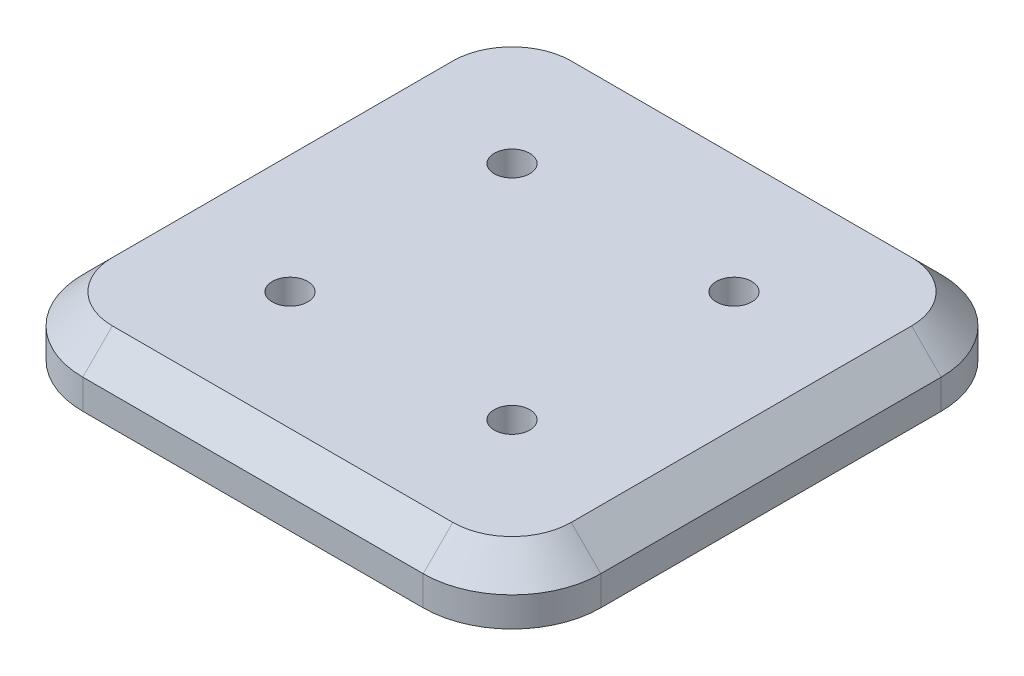
ISO-10303-21;
HEADER;
FILE_DESCRIPTION(('STEP AP214'),'2;1');
FILE_NAME('part.step','',(''),(''),'','','');
FILE_SCHEMA(('AUTOMOTIVE_DESIGN { 1 0 10303 214 1 1 1 1 }'));
ENDSEC;
DATA;
#1=APPLICATION_CONTEXT('core data for automotive mechanical design processes');
#2=APPLICATION_PROTOCOL_DEFINITION('international standard','automotive_design',2000,#1);
#3=PRODUCT_CONTEXT('',#1,'mechanical');
#4=PRODUCT('Part','Part','',(#3));
#5=PRODUCT_RELATED_PRODUCT_CATEGORY('part','',(#4));
#6=PRODUCT_DEFINITION_FORMATION('','',#4);
#7=PRODUCT_DEFINITION_CONTEXT('part definition',#1,'design');
#8=PRODUCT_DEFINITION('design','',#6,#7);
#9=PRODUCT_DEFINITION_SHAPE('','',#8);
#10=(LENGTH_UNIT() NAMED_UNIT(*) SI_UNIT(.MILLI.,.METRE.));
#11=(NAMED_UNIT(*) PLANE_ANGLE_UNIT() SI_UNIT($,.RADIAN.));
#12=(NAMED_UNIT(*) SI_UNIT($,.STERADIAN.) SOLID_ANGLE_UNIT());
#13=UNCERTAINTY_MEASURE_WITH_UNIT(LENGTH_MEASURE(1.E-05),#10,'distance_accuracy_value','');
#14=(GEOMETRIC_REPRESENTATION_CONTEXT(3) GLOBAL_UNCERTAINTY_ASSIGNED_CONTEXT((#13)) GLOBAL_UNIT_ASSIGNED_CONTEXT((#10,
#11,#12)) REPRESENTATION_CONTEXT('',''));
#15=CARTESIAN_POINT('',(0.,0.,0.));
#16=DIRECTION('',(0.,0.,1.));
#17=DIRECTION('',(1.,0.,0.));
#18=AXIS2_PLACEMENT_3D('',#15,#16,#17);
#19=CARTESIAN_POINT('',(0.,20.,0.));
#20=DIRECTION('',(1.,0.,0.));
#21=DIRECTION('',(0.,0.,-1.));
#22=AXIS2_PLACEMENT_3D('',#19,#20,#21);
#23=PLANE('',#22);
#24=DIRECTION('',(0.,-1.,0.));
#25=VECTOR('',#24,1.);
#26=CARTESIAN_POINT('',(0.,20.,-30.));
#27=LINE('',#26,#25);
#28=CARTESIAN_POINT('',(0.,0.,-30.));
#29=VERTEX_POINT('',#28);
#30=CARTESIAN_POINT('',(0.,10.,-30.));
#31=VERTEX_POINT('',#30);
#32=EDGE_CURVE('E217',#29,#31,#27,.F.);
#33=ORIENTED_EDGE('',*,*,#32,.T.);
#34=DIRECTION('',(0.,0.,-1.));
#35=VECTOR('',#34,1.);
#36=CARTESIAN_POINT('',(0.,10.,0.));
#37=LINE('',#36,#35);
#38=CARTESIAN_POINT('',(0.,10.,-145.));
#39=VERTEX_POINT('',#38);
#40=EDGE_CURVE('E261',#31,#39,#37,.T.);
#41=ORIENTED_EDGE('',*,*,#40,.T.);
#42=DIRECTION('',(0.,-1.,0.));
#43=VECTOR('',#42,1.);
#44=CARTESIAN_POINT('',(0.,20.,-145.));
#45=LINE('',#44,#43);
#46=CARTESIAN_POINT('',(0.,0.,-145.));
#47=VERTEX_POINT('',#46);
#48=EDGE_CURVE('E220',#39,#47,#45,.T.);
#49=ORIENTED_EDGE('',*,*,#48,.T.);
#50=DIRECTION('',(0.,0.,1.));
#51=VECTOR('',#50,1.);
#52=CARTESIAN_POINT('',(0.,0.,0.));
#53=LINE('',#52,#51);
#54=EDGE_CURVE('E205',#47,#29,#53,.T.);
#55=ORIENTED_EDGE('',*,*,#54,.T.);
#56=EDGE_LOOP('',(#33,#41,#49,#55));
#57=FACE_BOUND('',#56,.T.);
#58=ADVANCED_FACE('F35',(#57),#23,.F.);
#59=CARTESIAN_POINT('',(0.,20.,0.));
#60=DIRECTION('',(0.,0.,-1.));
#61=DIRECTION('',(-1.,0.,0.));
#62=AXIS2_PLACEMENT_3D('',#59,#60,#61);
#63=PLANE('',#62);
#64=DIRECTION('',(0.,-1.,0.));
#65=VECTOR('',#64,1.);
#66=CARTESIAN_POINT('',(145.,20.,0.));
#67=LINE('',#66,#65);
#68=CARTESIAN_POINT('',(145.,0.,0.));
#69=VERTEX_POINT('',#68);
#70=CARTESIAN_POINT('',(145.,10.,0.));
#71=VERTEX_POINT('',#70);
#72=EDGE_CURVE('E241',#69,#71,#67,.F.);
#73=ORIENTED_EDGE('',*,*,#72,.T.);
#74=DIRECTION('',(-1.,0.,0.));
#75=VECTOR('',#74,1.);
#76=CARTESIAN_POINT('',(0.,10.,0.));
#77=LINE('',#76,#75);
#78=CARTESIAN_POINT('',(30.,10.,0.));
#79=VERTEX_POINT('',#78);
#80=EDGE_CURVE('E268',#71,#79,#77,.T.);
#81=ORIENTED_EDGE('',*,*,#80,.T.);
#82=DIRECTION('',(0.,-1.,0.));
#83=VECTOR('',#82,1.);
#84=CARTESIAN_POINT('',(30.,20.,0.));
#85=LINE('',#84,#83);
#86=CARTESIAN_POINT('',(30.,0.,0.));
#87=VERTEX_POINT('',#86);
#88=EDGE_CURVE('E239',#79,#87,#85,.T.);
#89=ORIENTED_EDGE('',*,*,#88,.T.);
#90=DIRECTION('',(1.,0.,0.));
#91=VECTOR('',#90,1.);
#92=CARTESIAN_POINT('',(0.,0.,0.));
#93=LINE('',#92,#91);
#94=EDGE_CURVE('E208',#87,#69,#93,.T.);
#95=ORIENTED_EDGE('',*,*,#94,.T.);
#96=EDGE_LOOP('',(#73,#81,#89,#95));
#97=FACE_BOUND('',#96,.T.);
#98=ADVANCED_FACE('F311',(#97),#63,.F.);
#99=CARTESIAN_POINT('',(175.,20.,0.));
#100=DIRECTION('',(-1.,0.,0.));
#101=DIRECTION('',(0.,0.,1.));
#102=AXIS2_PLACEMENT_3D('',#99,#100,#101);
#103=PLANE('',#102);
#104=DIRECTION('',(0.,-1.,0.));
#105=VECTOR('',#104,1.);
#106=CARTESIAN_POINT('',(175.,20.,-145.));
#107=LINE('',#106,#105);
#108=CARTESIAN_POINT('',(175.,0.,-145.));
#109=VERTEX_POINT('',#108);
#110=CARTESIAN_POINT('',(175.,10.,-145.));
#111=VERTEX_POINT('',#110);
#112=EDGE_CURVE('E237',#109,#111,#107,.F.);
#113=ORIENTED_EDGE('',*,*,#112,.T.);
#114=DIRECTION('',(0.,0.,1.));
#115=VECTOR('',#114,1.);
#116=CARTESIAN_POINT('',(175.,10.,0.));
#117=LINE('',#116,#115);
#118=CARTESIAN_POINT('',(175.,10.,-30.));
#119=VERTEX_POINT('',#118);
#120=EDGE_CURVE('E11',#111,#119,#117,.T.);
#121=ORIENTED_EDGE('',*,*,#120,.T.);
#122=DIRECTION('',(0.,-1.,0.));
#123=VECTOR('',#122,1.);
#124=CARTESIAN_POINT('',(175.,20.,-30.));
#125=LINE('',#124,#123);
#126=CARTESIAN_POINT('',(175.,0.,-30.));
#127=VERTEX_POINT('',#126);
#128=EDGE_CURVE('E235',#119,#127,#125,.T.);
#129=ORIENTED_EDGE('',*,*,#128,.T.);
#130=DIRECTION('',(0.,0.,-1.));
#131=VECTOR('',#130,1.);
#132=CARTESIAN_POINT('',(175.,0.,0.));
#133=LINE('',#132,#131);
#134=EDGE_CURVE('E211',#127,#109,#133,.T.);
#135=ORIENTED_EDGE('',*,*,#134,.T.);
#136=EDGE_LOOP('',(#113,#121,#129,#135));
#137=FACE_BOUND('',#136,.T.);
#138=ADVANCED_FACE('F321',(#137),#103,.F.);
#139=CARTESIAN_POINT('',(0.,20.,-175.));
#140=DIRECTION('',(0.,0.,1.));
#141=DIRECTION('',(1.,0.,0.));
#142=AXIS2_PLACEMENT_3D('',#139,#140,#141);
#143=PLANE('',#142);
#144=DIRECTION('',(0.,-1.,0.));
#145=VECTOR('',#144,1.);
#146=CARTESIAN_POINT('',(30.,20.,-175.));
#147=LINE('',#146,#145);
#148=CARTESIAN_POINT('',(30.,0.,-175.));
#149=VERTEX_POINT('',#148);
#150=CARTESIAN_POINT('',(30.,10.,-175.));
#151=VERTEX_POINT('',#150);
#152=EDGE_CURVE('E232',#149,#151,#147,.F.);
#153=ORIENTED_EDGE('',*,*,#152,.T.);
#154=DIRECTION('',(1.,0.,0.));
#155=VECTOR('',#154,1.);
#156=CARTESIAN_POINT('',(0.,10.,-175.));
#157=LINE('',#156,#155);
#158=CARTESIAN_POINT('',(145.,10.,-175.));
#159=VERTEX_POINT('',#158);
#160=EDGE_CURVE('E270',#151,#159,#157,.T.);
#161=ORIENTED_EDGE('',*,*,#160,.T.);
#162=DIRECTION('',(0.,-1.,0.));
#163=VECTOR('',#162,1.);
#164=CARTESIAN_POINT('',(145.,20.,-175.));
#165=LINE('',#164,#163);
#166=CARTESIAN_POINT('',(145.,0.,-175.));
#167=VERTEX_POINT('',#166);
#168=EDGE_CURVE('E230',#159,#167,#165,.T.);
#169=ORIENTED_EDGE('',*,*,#168,.T.);
#170=DIRECTION('',(-1.,0.,0.));
#171=VECTOR('',#170,1.);
#172=CARTESIAN_POINT('',(0.,0.,-175.));
#173=LINE('',#172,#171);
#174=EDGE_CURVE('E214',#167,#149,#173,.T.);
#175=ORIENTED_EDGE('',*,*,#174,.T.);
#176=EDGE_LOOP('',(#153,#161,#169,#175));
#177=FACE_BOUND('',#176,.T.);
#178=ADVANCED_FACE('F326',(#177),#143,.F.);
#179=CARTESIAN_POINT('',(0.,20.,0.));
#180=DIRECTION('',(0.,-1.,0.));
#181=DIRECTION('',(0.,0.,-1.));
#182=AXIS2_PLACEMENT_3D('',#179,#180,#181);
#183=PLANE('',#182);
#184=CARTESIAN_POINT('',(50.,20.,-50.));
#185=DIRECTION('',(0.,1.,0.));
#186=DIRECTION('',(0.,0.,1.));
#187=AXIS2_PLACEMENT_3D('',#184,#185,#186);
#188=CIRCLE('',#187,5.99999999999999);
#189=CARTESIAN_POINT('',(50.,20.,-44.));
#190=VERTEX_POINT('',#189);
#191=EDGE_CURVE('E158',#190,#190,#188,.T.);
#192=ORIENTED_EDGE('',*,*,#191,.F.);
#193=EDGE_LOOP('',(#192));
#194=FACE_BOUND('',#193,.T.);
#195=CARTESIAN_POINT('',(50.,20.,-125.));
#196=DIRECTION('',(0.,1.,0.));
#197=DIRECTION('',(0.,0.,1.));
#198=AXIS2_PLACEMENT_3D('',#195,#196,#197);
#199=CIRCLE('',#198,5.99999999999999);
#200=CARTESIAN_POINT('',(50.,20.,-119.));
#201=VERTEX_POINT('',#200);
#202=EDGE_CURVE('E157',#201,#201,#199,.T.);
#203=ORIENTED_EDGE('',*,*,#202,.F.);
#204=EDGE_LOOP('',(#203));
#205=FACE_BOUND('',#204,.T.);
#206=CARTESIAN_POINT('',(125.,20.,-125.));
#207=DIRECTION('',(0.,1.,0.));
#208=DIRECTION('',(0.,0.,1.));
#209=AXIS2_PLACEMENT_3D('',#206,#207,#208);
#210=CIRCLE('',#209,5.99999999999998);
#211=CARTESIAN_POINT('',(125.,20.,-119.));
#212=VERTEX_POINT('',#211);
#213=EDGE_CURVE('E168',#212,#212,#210,.T.);
#214=ORIENTED_EDGE('',*,*,#213,.F.);
#215=EDGE_LOOP('',(#214));
#216=FACE_BOUND('',#215,.T.);
#217=CARTESIAN_POINT('',(125.,20.,-50.));
#218=DIRECTION('',(0.,1.,0.));
#219=DIRECTION('',(0.,0.,1.));
#220=AXIS2_PLACEMENT_3D('',#217,#218,#219);
#221=CIRCLE('',#220,5.99999999999998);
#222=CARTESIAN_POINT('',(125.,20.,-44.));
#223=VERTEX_POINT('',#222);
#224=EDGE_CURVE('E174',#223,#223,#221,.T.);
#225=ORIENTED_EDGE('',*,*,#224,.F.);
#226=EDGE_LOOP('',(#225));
#227=FACE_BOUND('',#226,.T.);
#228=CARTESIAN_POINT('',(30.,20.,-145.));
#229=DIRECTION('',(0.,-1.,0.));
#230=DIRECTION('',(0.,0.,-1.));
#231=AXIS2_PLACEMENT_3D('',#228,#229,#230);
#232=CIRCLE('',#231,20.);
#233=CARTESIAN_POINT('',(30.,20.,-165.));
#234=VERTEX_POINT('',#233);
#235=CARTESIAN_POINT('',(9.99999999999998,20.,-145.));
#236=VERTEX_POINT('',#235);
#237=EDGE_CURVE('E254',#234,#236,#232,.F.);
#238=ORIENTED_EDGE('',*,*,#237,.T.);
#239=DIRECTION('',(0.,0.,1.));
#240=VECTOR('',#239,1.);
#241=CARTESIAN_POINT('',(9.99999999999998,20.,0.));
#242=LINE('',#241,#240);
#243=CARTESIAN_POINT('',(9.99999999999998,20.,-30.));
#244=VERTEX_POINT('',#243);
#245=EDGE_CURVE('E258',#236,#244,#242,.T.);
#246=ORIENTED_EDGE('',*,*,#245,.T.);
#247=CARTESIAN_POINT('',(30.,20.,-30.));
#248=DIRECTION('',(0.,-1.,0.));
#249=DIRECTION('',(0.,0.,-1.));
#250=AXIS2_PLACEMENT_3D('',#247,#248,#249);
#251=CIRCLE('',#250,20.);
#252=CARTESIAN_POINT('',(30.,20.,-9.99999999999998));
#253=VERTEX_POINT('',#252);
#254=EDGE_CURVE('E256',#244,#253,#251,.F.);
#255=ORIENTED_EDGE('',*,*,#254,.T.);
#256=DIRECTION('',(1.,0.,0.));
#257=VECTOR('',#256,1.);
#258=CARTESIAN_POINT('',(0.,20.,-9.99999999999998));
#259=LINE('',#258,#257);
#260=CARTESIAN_POINT('',(145.,20.,-9.99999999999998));
#261=VERTEX_POINT('',#260);
#262=EDGE_CURVE('E252',#253,#261,#259,.T.);
#263=ORIENTED_EDGE('',*,*,#262,.T.);
#264=CARTESIAN_POINT('',(145.,20.,-30.));
#265=DIRECTION('',(0.,-1.,0.));
#266=DIRECTION('',(0.,0.,-1.));
#267=AXIS2_PLACEMENT_3D('',#264,#265,#266);
#268=CIRCLE('',#267,20.);
#269=CARTESIAN_POINT('',(165.,20.,-30.));
#270=VERTEX_POINT('',#269);
#271=EDGE_CURVE('E248',#261,#270,#268,.F.);
#272=ORIENTED_EDGE('',*,*,#271,.T.);
#273=DIRECTION('',(0.,0.,-1.));
#274=VECTOR('',#273,1.);
#275=CARTESIAN_POINT('',(165.,20.,0.));
#276=LINE('',#275,#274);
#277=CARTESIAN_POINT('',(165.,20.,-145.));
#278=VERTEX_POINT('',#277);
#279=EDGE_CURVE('E244',#270,#278,#276,.T.);
#280=ORIENTED_EDGE('',*,*,#279,.T.);
#281=CARTESIAN_POINT('',(145.,20.,-145.));
#282=DIRECTION('',(0.,-1.,0.));
#283=DIRECTION('',(0.,0.,-1.));
#284=AXIS2_PLACEMENT_3D('',#281,#282,#283);
#285=CIRCLE('',#284,20.);
#286=CARTESIAN_POINT('',(145.,20.,-165.));
#287=VERTEX_POINT('',#286);
#288=EDGE_CURVE('E246',#278,#287,#285,.F.);
#289=ORIENTED_EDGE('',*,*,#288,.T.);
#290=DIRECTION('',(-1.,0.,0.));
#291=VECTOR('',#290,1.);
#292=CARTESIAN_POINT('',(0.,20.,-165.));
#293=LINE('',#292,#291);
#294=EDGE_CURVE('E250',#287,#234,#293,.T.);
#295=ORIENTED_EDGE('',*,*,#294,.T.);
#296=EDGE_LOOP('',(#238,#246,#255,#263,#272,#280,#289,#295));
#297=FACE_BOUND('',#296,.T.);
#298=ADVANCED_FACE('F351',(#194,#205,#216,#227,#297),#183,.F.);
#299=CARTESIAN_POINT('',(0.,0.,0.));
#300=DIRECTION('',(0.,-1.,0.));
#301=DIRECTION('',(0.,0.,-1.));
#302=AXIS2_PLACEMENT_3D('',#299,#300,#301);
#303=PLANE('',#302);
#304=CARTESIAN_POINT('',(25.,0.,-25.));
#305=DIRECTION('',(0.,-1.,0.));
#306=DIRECTION('',(0.,0.,-1.));
#307=AXIS2_PLACEMENT_3D('',#304,#305,#306);
#308=CIRCLE('',#307,5.99999999999999);
#309=CARTESIAN_POINT('',(25.,0.,-31.));
#310=VERTEX_POINT('',#309);
#311=EDGE_CURVE('E180',#310,#310,#308,.T.);
#312=ORIENTED_EDGE('',*,*,#311,.F.);
#313=EDGE_LOOP('',(#312));
#314=FACE_BOUND('',#313,.T.);
#315=CARTESIAN_POINT('',(150.,0.,-25.));
#316=DIRECTION('',(0.,-1.,0.));
#317=DIRECTION('',(0.,0.,-1.));
#318=AXIS2_PLACEMENT_3D('',#315,#316,#317);
#319=CIRCLE('',#318,5.99999999999998);
#320=CARTESIAN_POINT('',(150.,0.,-31.));
#321=VERTEX_POINT('',#320);
#322=EDGE_CURVE('E186',#321,#321,#319,.T.);
#323=ORIENTED_EDGE('',*,*,#322,.F.);
#324=EDGE_LOOP('',(#323));
#325=FACE_BOUND('',#324,.T.);
#326=CARTESIAN_POINT('',(150.,0.,-150.));
#327=DIRECTION('',(0.,-1.,0.));
#328=DIRECTION('',(0.,0.,-1.));
#329=AXIS2_PLACEMENT_3D('',#326,#327,#328);
#330=CIRCLE('',#329,5.99999999999998);
#331=CARTESIAN_POINT('',(150.,0.,-156.));
#332=VERTEX_POINT('',#331);
#333=EDGE_CURVE('E192',#332,#332,#330,.T.);
#334=ORIENTED_EDGE('',*,*,#333,.F.);
#335=EDGE_LOOP('',(#334));
#336=FACE_BOUND('',#335,.T.);
#337=CARTESIAN_POINT('',(25.,0.,-150.));
#338=DIRECTION('',(0.,-1.,0.));
#339=DIRECTION('',(0.,0.,-1.));
#340=AXIS2_PLACEMENT_3D('',#337,#338,#339);
#341=CIRCLE('',#340,5.99999999999999);
#342=CARTESIAN_POINT('',(25.,0.,-156.));
#343=VERTEX_POINT('',#342);
#344=EDGE_CURVE('E198',#343,#343,#341,.T.);
#345=ORIENTED_EDGE('',*,*,#344,.F.);
#346=EDGE_LOOP('',(#345));
#347=FACE_BOUND('',#346,.T.);
#348=ORIENTED_EDGE('',*,*,#54,.F.);
#349=CARTESIAN_POINT('',(30.,0.,-145.));
#350=DIRECTION('',(0.,-1.,0.));
#351=DIRECTION('',(0.,0.,-1.));
#352=AXIS2_PLACEMENT_3D('',#349,#350,#351);
#353=CIRCLE('',#352,30.);
#354=EDGE_CURVE('E228',#47,#149,#353,.T.);
#355=ORIENTED_EDGE('',*,*,#354,.T.);
#356=ORIENTED_EDGE('',*,*,#174,.F.);
#357=CARTESIAN_POINT('',(145.,0.,-145.));
#358=DIRECTION('',(0.,-1.,0.));
#359=DIRECTION('',(0.,0.,-1.));
#360=AXIS2_PLACEMENT_3D('',#357,#358,#359);
#361=CIRCLE('',#360,30.);
#362=EDGE_CURVE('E226',#167,#109,#361,.T.);
#363=ORIENTED_EDGE('',*,*,#362,.T.);
#364=ORIENTED_EDGE('',*,*,#134,.F.);
#365=CARTESIAN_POINT('',(145.,0.,-30.));
#366=DIRECTION('',(0.,-1.,0.));
#367=DIRECTION('',(0.,0.,-1.));
#368=AXIS2_PLACEMENT_3D('',#365,#366,#367);
#369=CIRCLE('',#368,30.);
#370=EDGE_CURVE('E224',#127,#69,#369,.T.);
#371=ORIENTED_EDGE('',*,*,#370,.T.);
#372=ORIENTED_EDGE('',*,*,#94,.F.);
#373=CARTESIAN_POINT('',(30.,0.,-30.));
#374=DIRECTION('',(0.,-1.,0.));
#375=DIRECTION('',(0.,0.,-1.));
#376=AXIS2_PLACEMENT_3D('',#373,#374,#375);
#377=CIRCLE('',#376,30.);
#378=EDGE_CURVE('E222',#87,#29,#377,.T.);
#379=ORIENTED_EDGE('',*,*,#378,.T.);
#380=EDGE_LOOP('',(#348,#355,#356,#363,#364,#371,#372,#379));
#381=FACE_BOUND('',#380,.T.);
#382=ADVANCED_FACE('F317',(#314,#325,#336,#347,#381),#303,.T.);
#383=CARTESIAN_POINT('',(30.,20.,-145.));
#384=DIRECTION('',(0.,-1.,0.));
#385=DIRECTION('',(0.,0.,-1.));
#386=AXIS2_PLACEMENT_3D('',#383,#384,#385);
#387=CYLINDRICAL_SURFACE('',#386,30.);
#388=ORIENTED_EDGE('',*,*,#48,.F.);
#389=CARTESIAN_POINT('',(30.,10.,-145.));
#390=DIRECTION('',(0.,-1.,0.));
#391=DIRECTION('',(0.,0.,-1.));
#392=AXIS2_PLACEMENT_3D('',#389,#390,#391);
#393=CIRCLE('',#392,30.);
#394=EDGE_CURVE('E266',#39,#151,#393,.T.);
#395=ORIENTED_EDGE('',*,*,#394,.T.);
#396=ORIENTED_EDGE('',*,*,#152,.F.);
#397=ORIENTED_EDGE('',*,*,#354,.F.);
#398=EDGE_LOOP('',(#388,#395,#396,#397));
#399=FACE_BOUND('',#398,.T.);
#400=ADVANCED_FACE('F330',(#399),#387,.T.);
#401=CARTESIAN_POINT('',(145.,20.,-145.));
#402=DIRECTION('',(0.,-1.,0.));
#403=DIRECTION('',(0.,0.,-1.));
#404=AXIS2_PLACEMENT_3D('',#401,#402,#403);
#405=CYLINDRICAL_SURFACE('',#404,30.);
#406=ORIENTED_EDGE('',*,*,#168,.F.);
#407=CARTESIAN_POINT('',(145.,10.,-145.));
#408=DIRECTION('',(0.,-1.,0.));
#409=DIRECTION('',(0.,0.,-1.));
#410=AXIS2_PLACEMENT_3D('',#407,#408,#409);
#411=CIRCLE('',#410,30.);
#412=EDGE_CURVE('E44',#159,#111,#411,.T.);
#413=ORIENTED_EDGE('',*,*,#412,.T.);
#414=ORIENTED_EDGE('',*,*,#112,.F.);
#415=ORIENTED_EDGE('',*,*,#362,.F.);
#416=EDGE_LOOP('',(#406,#413,#414,#415));
#417=FACE_BOUND('',#416,.T.);
#418=ADVANCED_FACE('F322',(#417),#405,.T.);
#419=CARTESIAN_POINT('',(145.,20.,-30.));
#420=DIRECTION('',(0.,-1.,0.));
#421=DIRECTION('',(0.,0.,-1.));
#422=AXIS2_PLACEMENT_3D('',#419,#420,#421);
#423=CYLINDRICAL_SURFACE('',#422,30.);
#424=ORIENTED_EDGE('',*,*,#128,.F.);
#425=CARTESIAN_POINT('',(145.,10.,-30.));
#426=DIRECTION('',(0.,-1.,0.));
#427=DIRECTION('',(0.,0.,-1.));
#428=AXIS2_PLACEMENT_3D('',#425,#426,#427);
#429=CIRCLE('',#428,30.);
#430=EDGE_CURVE('E272',#119,#71,#429,.T.);
#431=ORIENTED_EDGE('',*,*,#430,.T.);
#432=ORIENTED_EDGE('',*,*,#72,.F.);
#433=ORIENTED_EDGE('',*,*,#370,.F.);
#434=EDGE_LOOP('',(#424,#431,#432,#433));
#435=FACE_BOUND('',#434,.T.);
#436=ADVANCED_FACE('F308',(#435),#423,.T.);
#437=CARTESIAN_POINT('',(30.,20.,-30.));
#438=DIRECTION('',(0.,-1.,0.));
#439=DIRECTION('',(0.,0.,-1.));
#440=AXIS2_PLACEMENT_3D('',#437,#438,#439);
#441=CYLINDRICAL_SURFACE('',#440,30.);
#442=ORIENTED_EDGE('',*,*,#88,.F.);
#443=CARTESIAN_POINT('',(30.,10.,-30.));
#444=DIRECTION('',(0.,-1.,0.));
#445=DIRECTION('',(0.,0.,-1.));
#446=AXIS2_PLACEMENT_3D('',#443,#444,#445);
#447=CIRCLE('',#446,30.);
#448=EDGE_CURVE('E264',#79,#31,#447,.T.);
#449=ORIENTED_EDGE('',*,*,#448,.T.);
#450=ORIENTED_EDGE('',*,*,#32,.F.);
#451=ORIENTED_EDGE('',*,*,#378,.F.);
#452=EDGE_LOOP('',(#442,#449,#450,#451));
#453=FACE_BOUND('',#452,.T.);
#454=ADVANCED_FACE('F379',(#453),#441,.T.);
#455=CARTESIAN_POINT('',(165.,20.,0.));
#456=DIRECTION('',(-0.707106781186547,-0.707106781186547,0.));
#457=DIRECTION('',(0.,0.,-1.));
#458=AXIS2_PLACEMENT_3D('',#455,#456,#457);
#459=PLANE('',#458);
#460=DIRECTION('',(-0.707106781186547,0.707106781186547,0.));
#461=VECTOR('',#460,1.);
#462=CARTESIAN_POINT('',(175.,10.,-30.));
#463=LINE('',#462,#461);
#464=EDGE_CURVE('E289',#119,#270,#463,.T.);
#465=ORIENTED_EDGE('',*,*,#464,.F.);
#466=ORIENTED_EDGE('',*,*,#120,.F.);
#467=DIRECTION('',(0.707106781186547,-0.707106781186547,0.));
#468=VECTOR('',#467,1.);
#469=CARTESIAN_POINT('',(165.,20.,-145.));
#470=LINE('',#469,#468);
#471=EDGE_CURVE('E39',#278,#111,#470,.T.);
#472=ORIENTED_EDGE('',*,*,#471,.F.);
#473=ORIENTED_EDGE('',*,*,#279,.F.);
#474=EDGE_LOOP('',(#465,#466,#472,#473));
#475=FACE_BOUND('',#474,.T.);
#476=ADVANCED_FACE('F37',(#475),#459,.F.);
#477=CARTESIAN_POINT('',(145.,20.,-145.));
#478=DIRECTION('',(0.,-1.,0.));
#479=DIRECTION('',(0.,0.,-1.));
#480=AXIS2_PLACEMENT_3D('',#477,#478,#479);
#481=CONICAL_SURFACE('',#480,20.,0.785398163397448);
#482=ORIENTED_EDGE('',*,*,#471,.T.);
#483=ORIENTED_EDGE('',*,*,#412,.F.);
#484=DIRECTION('',(0.,-0.707106781186547,-0.707106781186547));
#485=VECTOR('',#484,1.);
#486=CARTESIAN_POINT('',(145.,20.,-165.));
#487=LINE('',#486,#485);
#488=EDGE_CURVE('E287',#287,#159,#487,.T.);
#489=ORIENTED_EDGE('',*,*,#488,.F.);
#490=ORIENTED_EDGE('',*,*,#288,.F.);
#491=EDGE_LOOP('',(#482,#483,#489,#490));
#492=FACE_BOUND('',#491,.T.);
#493=ADVANCED_FACE('F299',(#492),#481,.T.);
#494=CARTESIAN_POINT('',(145.,20.,-30.));
#495=DIRECTION('',(0.,-1.,0.));
#496=DIRECTION('',(0.,0.,-1.));
#497=AXIS2_PLACEMENT_3D('',#494,#495,#496);
#498=CONICAL_SURFACE('',#497,20.,0.785398163397448);
#499=ORIENTED_EDGE('',*,*,#464,.T.);
#500=ORIENTED_EDGE('',*,*,#271,.F.);
#501=DIRECTION('',(0.,0.707106781186547,-0.707106781186547));
#502=VECTOR('',#501,1.);
#503=CARTESIAN_POINT('',(145.,10.,0.));
#504=LINE('',#503,#502);
#505=EDGE_CURVE('E284',#71,#261,#504,.T.);
#506=ORIENTED_EDGE('',*,*,#505,.F.);
#507=ORIENTED_EDGE('',*,*,#430,.F.);
#508=EDGE_LOOP('',(#499,#500,#506,#507));
#509=FACE_BOUND('',#508,.T.);
#510=ADVANCED_FACE('F304',(#509),#498,.T.);
#511=CARTESIAN_POINT('',(0.,20.,-165.));
#512=DIRECTION('',(0.,-0.707106781186547,0.707106781186547));
#513=DIRECTION('',(-1.,0.,0.));
#514=AXIS2_PLACEMENT_3D('',#511,#512,#513);
#515=PLANE('',#514);
#516=ORIENTED_EDGE('',*,*,#488,.T.);
#517=ORIENTED_EDGE('',*,*,#160,.F.);
#518=DIRECTION('',(0.,-0.707106781186547,-0.707106781186547));
#519=VECTOR('',#518,1.);
#520=CARTESIAN_POINT('',(30.,20.,-165.));
#521=LINE('',#520,#519);
#522=EDGE_CURVE('E281',#234,#151,#521,.T.);
#523=ORIENTED_EDGE('',*,*,#522,.F.);
#524=ORIENTED_EDGE('',*,*,#294,.F.);
#525=EDGE_LOOP('',(#516,#517,#523,#524));
#526=FACE_BOUND('',#525,.T.);
#527=ADVANCED_FACE('F354',(#526),#515,.F.);
#528=CARTESIAN_POINT('',(0.,20.,-9.99999999999998));
#529=DIRECTION('',(0.,-0.707106781186547,-0.707106781186547));
#530=DIRECTION('',(1.,0.,0.));
#531=AXIS2_PLACEMENT_3D('',#528,#529,#530);
#532=PLANE('',#531);
#533=ORIENTED_EDGE('',*,*,#505,.T.);
#534=ORIENTED_EDGE('',*,*,#262,.F.);
#535=DIRECTION('',(0.,0.707106781186547,-0.707106781186547));
#536=VECTOR('',#535,1.);
#537=CARTESIAN_POINT('',(30.,10.,0.));
#538=LINE('',#537,#536);
#539=EDGE_CURVE('E278',#79,#253,#538,.T.);
#540=ORIENTED_EDGE('',*,*,#539,.F.);
#541=ORIENTED_EDGE('',*,*,#80,.F.);
#542=EDGE_LOOP('',(#533,#534,#540,#541));
#543=FACE_BOUND('',#542,.T.);
#544=ADVANCED_FACE('F356',(#543),#532,.F.);
#545=CARTESIAN_POINT('',(30.,20.,-145.));
#546=DIRECTION('',(0.,-1.,0.));
#547=DIRECTION('',(0.,0.,-1.));
#548=AXIS2_PLACEMENT_3D('',#545,#546,#547);
#549=CONICAL_SURFACE('',#548,20.,0.785398163397448);
#550=ORIENTED_EDGE('',*,*,#522,.T.);
#551=ORIENTED_EDGE('',*,*,#394,.F.);
#552=DIRECTION('',(-0.707106781186547,-0.707106781186547,0.));
#553=VECTOR('',#552,1.);
#554=CARTESIAN_POINT('',(9.99999999999998,20.,-145.));
#555=LINE('',#554,#553);
#556=EDGE_CURVE('E276',#236,#39,#555,.T.);
#557=ORIENTED_EDGE('',*,*,#556,.F.);
#558=ORIENTED_EDGE('',*,*,#237,.F.);
#559=EDGE_LOOP('',(#550,#551,#557,#558));
#560=FACE_BOUND('',#559,.T.);
#561=ADVANCED_FACE('F334',(#560),#549,.T.);
#562=CARTESIAN_POINT('',(30.,20.,-30.));
#563=DIRECTION('',(0.,-1.,0.));
#564=DIRECTION('',(0.,0.,-1.));
#565=AXIS2_PLACEMENT_3D('',#562,#563,#564);
#566=CONICAL_SURFACE('',#565,20.,0.785398163397448);
#567=ORIENTED_EDGE('',*,*,#539,.T.);
#568=ORIENTED_EDGE('',*,*,#254,.F.);
#569=DIRECTION('',(0.707106781186547,0.707106781186547,0.));
#570=VECTOR('',#569,1.);
#571=CARTESIAN_POINT('',(0.,10.,-30.));
#572=LINE('',#571,#570);
#573=EDGE_CURVE('E204',#31,#244,#572,.T.);
#574=ORIENTED_EDGE('',*,*,#573,.F.);
#575=ORIENTED_EDGE('',*,*,#448,.F.);
#576=EDGE_LOOP('',(#567,#568,#574,#575));
#577=FACE_BOUND('',#576,.T.);
#578=ADVANCED_FACE('F347',(#577),#566,.T.);
#579=CARTESIAN_POINT('',(9.99999999999998,20.,0.));
#580=DIRECTION('',(0.707106781186547,-0.707106781186547,0.));
#581=DIRECTION('',(0.,0.,1.));
#582=AXIS2_PLACEMENT_3D('',#579,#580,#581);
#583=PLANE('',#582);
#584=ORIENTED_EDGE('',*,*,#556,.T.);
#585=ORIENTED_EDGE('',*,*,#40,.F.);
#586=ORIENTED_EDGE('',*,*,#573,.T.);
#587=ORIENTED_EDGE('',*,*,#245,.F.);
#588=EDGE_LOOP('',(#584,#585,#586,#587));
#589=FACE_BOUND('',#588,.T.);
#590=ADVANCED_FACE('F343',(#589),#583,.F.);
#591=CARTESIAN_POINT('',(25.,9.99999999999999,-150.));
#592=DIRECTION('',(0.,-1.,0.));
#593=DIRECTION('',(0.,0.,-1.));
#594=AXIS2_PLACEMENT_3D('',#591,#592,#593);
#595=CONICAL_SURFACE('',#594,5.99999999999999,1.02974425867666);
#596=CARTESIAN_POINT('',(25.,13.6051637141653,-150.));
#597=VERTEX_POINT('',#596);
#598=VERTEX_LOOP('',#597);
#599=FACE_BOUND('',#598,.T.);
#600=CARTESIAN_POINT('',(25.,9.99999999999999,-150.));
#601=DIRECTION('',(0.,-1.,0.));
#602=DIRECTION('',(0.,0.,-1.));
#603=AXIS2_PLACEMENT_3D('',#600,#601,#602);
#604=CIRCLE('',#603,5.99999999999999);
#605=CARTESIAN_POINT('',(25.,9.99999999999999,-156.));
#606=VERTEX_POINT('',#605);
#607=EDGE_CURVE('E201',#606,#606,#604,.T.);
#608=ORIENTED_EDGE('',*,*,#607,.T.);
#609=EDGE_LOOP('',(#608));
#610=FACE_BOUND('',#609,.T.);
#611=ADVANCED_FACE('F385',(#599,#610),#595,.F.);
#612=CARTESIAN_POINT('',(25.,0.,-150.));
#613=DIRECTION('',(0.,-1.,0.));
#614=DIRECTION('',(0.,0.,-1.));
#615=AXIS2_PLACEMENT_3D('',#612,#613,#614);
#616=CYLINDRICAL_SURFACE('',#615,5.99999999999999);
#617=ORIENTED_EDGE('',*,*,#607,.F.);
#618=EDGE_LOOP('',(#617));
#619=FACE_BOUND('',#618,.T.);
#620=ORIENTED_EDGE('',*,*,#344,.T.);
#621=EDGE_LOOP('',(#620));
#622=FACE_BOUND('',#621,.T.);
#623=ADVANCED_FACE('F408',(#619,#622),#616,.F.);
#624=CARTESIAN_POINT('',(150.,9.99999999999999,-150.));
#625=DIRECTION('',(0.,-1.,0.));
#626=DIRECTION('',(0.,0.,-1.));
#627=AXIS2_PLACEMENT_3D('',#624,#625,#626);
#628=CONICAL_SURFACE('',#627,5.99999999999998,1.02974425867665);
#629=CARTESIAN_POINT('',(150.,13.6051637141653,-150.));
#630=VERTEX_POINT('',#629);
#631=VERTEX_LOOP('',#630);
#632=FACE_BOUND('',#631,.T.);
#633=CARTESIAN_POINT('',(150.,9.99999999999999,-150.));
#634=DIRECTION('',(0.,-1.,0.));
#635=DIRECTION('',(0.,0.,-1.));
#636=AXIS2_PLACEMENT_3D('',#633,#634,#635);
#637=CIRCLE('',#636,5.99999999999998);
#638=CARTESIAN_POINT('',(150.,9.99999999999999,-156.));
#639=VERTEX_POINT('',#638);
#640=EDGE_CURVE('E195',#639,#639,#637,.T.);
#641=ORIENTED_EDGE('',*,*,#640,.T.);
#642=EDGE_LOOP('',(#641));
#643=FACE_BOUND('',#642,.T.);
#644=ADVANCED_FACE('F417',(#632,#643),#628,.F.);
#645=CARTESIAN_POINT('',(150.,0.,-150.));
#646=DIRECTION('',(0.,-1.,0.));
#647=DIRECTION('',(0.,0.,-1.));
#648=AXIS2_PLACEMENT_3D('',#645,#646,#647);
#649=CYLINDRICAL_SURFACE('',#648,5.99999999999998);
#650=ORIENTED_EDGE('',*,*,#640,.F.);
#651=EDGE_LOOP('',(#650));
#652=FACE_BOUND('',#651,.T.);
#653=ORIENTED_EDGE('',*,*,#333,.T.);
#654=EDGE_LOOP('',(#653));
#655=FACE_BOUND('',#654,.T.);
#656=ADVANCED_FACE('F425',(#652,#655),#649,.F.);
#657=CARTESIAN_POINT('',(150.,9.99999999999999,-25.));
#658=DIRECTION('',(0.,-1.,0.));
#659=DIRECTION('',(0.,0.,-1.));
#660=AXIS2_PLACEMENT_3D('',#657,#658,#659);
#661=CONICAL_SURFACE('',#660,5.99999999999998,1.02974425867665);
#662=CARTESIAN_POINT('',(150.,13.6051637141653,-25.));
#663=VERTEX_POINT('',#662);
#664=VERTEX_LOOP('',#663);
#665=FACE_BOUND('',#664,.T.);
#666=CARTESIAN_POINT('',(150.,9.99999999999999,-25.));
#667=DIRECTION('',(0.,-1.,0.));
#668=DIRECTION('',(0.,0.,-1.));
#669=AXIS2_PLACEMENT_3D('',#666,#667,#668);
#670=CIRCLE('',#669,5.99999999999998);
#671=CARTESIAN_POINT('',(150.,9.99999999999999,-31.));
#672=VERTEX_POINT('',#671);
#673=EDGE_CURVE('E189',#672,#672,#670,.T.);
#674=ORIENTED_EDGE('',*,*,#673,.T.);
#675=EDGE_LOOP('',(#674));
#676=FACE_BOUND('',#675,.T.);
#677=ADVANCED_FACE('F433',(#665,#676),#661,.F.);
#678=CARTESIAN_POINT('',(150.,0.,-25.));
#679=DIRECTION('',(0.,-1.,0.));
#680=DIRECTION('',(0.,0.,-1.));
#681=AXIS2_PLACEMENT_3D('',#678,#679,#680);
#682=CYLINDRICAL_SURFACE('',#681,5.99999999999998);
#683=ORIENTED_EDGE('',*,*,#673,.F.);
#684=EDGE_LOOP('',(#683));
#685=FACE_BOUND('',#684,.T.);
#686=ORIENTED_EDGE('',*,*,#322,.T.);
#687=EDGE_LOOP('',(#686));
#688=FACE_BOUND('',#687,.T.);
#689=ADVANCED_FACE('F441',(#685,#688),#682,.F.);
#690=CARTESIAN_POINT('',(25.,9.99999999999999,-25.));
#691=DIRECTION('',(0.,-1.,0.));
#692=DIRECTION('',(0.,0.,-1.));
#693=AXIS2_PLACEMENT_3D('',#690,#691,#692);
#694=CONICAL_SURFACE('',#693,5.99999999999999,1.02974425867666);
#695=CARTESIAN_POINT('',(25.,13.6051637141653,-25.));
#696=VERTEX_POINT('',#695);
#697=VERTEX_LOOP('',#696);
#698=FACE_BOUND('',#697,.T.);
#699=CARTESIAN_POINT('',(25.,9.99999999999999,-25.));
#700=DIRECTION('',(0.,-1.,0.));
#701=DIRECTION('',(0.,0.,-1.));
#702=AXIS2_PLACEMENT_3D('',#699,#700,#701);
#703=CIRCLE('',#702,5.99999999999999);
#704=CARTESIAN_POINT('',(25.,9.99999999999999,-31.));
#705=VERTEX_POINT('',#704);
#706=EDGE_CURVE('E183',#705,#705,#703,.T.);
#707=ORIENTED_EDGE('',*,*,#706,.T.);
#708=EDGE_LOOP('',(#707));
#709=FACE_BOUND('',#708,.T.);
#710=ADVANCED_FACE('F449',(#698,#709),#694,.F.);
#711=CARTESIAN_POINT('',(25.,0.,-25.));
#712=DIRECTION('',(0.,-1.,0.));
#713=DIRECTION('',(0.,0.,-1.));
#714=AXIS2_PLACEMENT_3D('',#711,#712,#713);
#715=CYLINDRICAL_SURFACE('',#714,5.99999999999999);
#716=ORIENTED_EDGE('',*,*,#706,.F.);
#717=EDGE_LOOP('',(#716));
#718=FACE_BOUND('',#717,.T.);
#719=ORIENTED_EDGE('',*,*,#311,.T.);
#720=EDGE_LOOP('',(#719));
#721=FACE_BOUND('',#720,.T.);
#722=ADVANCED_FACE('F457',(#718,#721),#715,.F.);
#723=CARTESIAN_POINT('',(125.,10.,-50.));
#724=DIRECTION('',(0.,1.,0.));
#725=DIRECTION('',(0.,0.,1.));
#726=AXIS2_PLACEMENT_3D('',#723,#724,#725);
#727=CONICAL_SURFACE('',#726,5.99999999999998,1.02974425867665);
#728=CARTESIAN_POINT('',(125.,6.39483628583466,-50.));
#729=VERTEX_POINT('',#728);
#730=VERTEX_LOOP('',#729);
#731=FACE_BOUND('',#730,.T.);
#732=CARTESIAN_POINT('',(125.,10.,-50.));
#733=DIRECTION('',(0.,1.,0.));
#734=DIRECTION('',(0.,0.,1.));
#735=AXIS2_PLACEMENT_3D('',#732,#733,#734);
#736=CIRCLE('',#735,5.99999999999998);
#737=CARTESIAN_POINT('',(125.,10.,-44.));
#738=VERTEX_POINT('',#737);
#739=EDGE_CURVE('E177',#738,#738,#736,.T.);
#740=ORIENTED_EDGE('',*,*,#739,.T.);
#741=EDGE_LOOP('',(#740));
#742=FACE_BOUND('',#741,.T.);
#743=ADVANCED_FACE('F465',(#731,#742),#727,.F.);
#744=CARTESIAN_POINT('',(125.,20.,-50.));
#745=DIRECTION('',(0.,1.,0.));
#746=DIRECTION('',(0.,0.,1.));
#747=AXIS2_PLACEMENT_3D('',#744,#745,#746);
#748=CYLINDRICAL_SURFACE('',#747,5.99999999999998);
#749=ORIENTED_EDGE('',*,*,#739,.F.);
#750=EDGE_LOOP('',(#749));
#751=FACE_BOUND('',#750,.T.);
#752=ORIENTED_EDGE('',*,*,#224,.T.);
#753=EDGE_LOOP('',(#752));
#754=FACE_BOUND('',#753,.T.);
#755=ADVANCED_FACE('F473',(#751,#754),#748,.F.);
#756=CARTESIAN_POINT('',(125.,10.,-125.));
#757=DIRECTION('',(0.,1.,0.));
#758=DIRECTION('',(0.,0.,1.));
#759=AXIS2_PLACEMENT_3D('',#756,#757,#758);
#760=CONICAL_SURFACE('',#759,5.99999999999998,1.02974425867665);
#761=CARTESIAN_POINT('',(125.,6.39483628583466,-125.));
#762=VERTEX_POINT('',#761);
#763=VERTEX_LOOP('',#762);
#764=FACE_BOUND('',#763,.T.);
#765=CARTESIAN_POINT('',(125.,10.,-125.));
#766=DIRECTION('',(0.,1.,0.));
#767=DIRECTION('',(0.,0.,1.));
#768=AXIS2_PLACEMENT_3D('',#765,#766,#767);
#769=CIRCLE('',#768,5.99999999999998);
#770=CARTESIAN_POINT('',(125.,10.,-119.));
#771=VERTEX_POINT('',#770);
#772=EDGE_CURVE('E171',#771,#771,#769,.T.);
#773=ORIENTED_EDGE('',*,*,#772,.T.);
#774=EDGE_LOOP('',(#773));
#775=FACE_BOUND('',#774,.T.);
#776=ADVANCED_FACE('F481',(#764,#775),#760,.F.);
#777=CARTESIAN_POINT('',(125.,20.,-125.));
#778=DIRECTION('',(0.,1.,0.));
#779=DIRECTION('',(0.,0.,1.));
#780=AXIS2_PLACEMENT_3D('',#777,#778,#779);
#781=CYLINDRICAL_SURFACE('',#780,5.99999999999998);
#782=ORIENTED_EDGE('',*,*,#772,.F.);
#783=EDGE_LOOP('',(#782));
#784=FACE_BOUND('',#783,.T.);
#785=ORIENTED_EDGE('',*,*,#213,.T.);
#786=EDGE_LOOP('',(#785));
#787=FACE_BOUND('',#786,.T.);
#788=ADVANCED_FACE('F489',(#784,#787),#781,.F.);
#789=CARTESIAN_POINT('',(50.,10.,-125.));
#790=DIRECTION('',(0.,1.,0.));
#791=DIRECTION('',(0.,0.,1.));
#792=AXIS2_PLACEMENT_3D('',#789,#790,#791);
#793=CONICAL_SURFACE('',#792,5.99999999999999,1.02974425867666);
#794=CARTESIAN_POINT('',(50.,6.39483628583466,-125.));
#795=VERTEX_POINT('',#794);
#796=VERTEX_LOOP('',#795);
#797=FACE_BOUND('',#796,.T.);
#798=CARTESIAN_POINT('',(50.,10.,-125.));
#799=DIRECTION('',(0.,1.,0.));
#800=DIRECTION('',(0.,0.,1.));
#801=AXIS2_PLACEMENT_3D('',#798,#799,#800);
#802=CIRCLE('',#801,5.99999999999999);
#803=CARTESIAN_POINT('',(50.,10.,-119.));
#804=VERTEX_POINT('',#803);
#805=EDGE_CURVE('E161',#804,#804,#802,.T.);
#806=ORIENTED_EDGE('',*,*,#805,.T.);
#807=EDGE_LOOP('',(#806));
#808=FACE_BOUND('',#807,.T.);
#809=ADVANCED_FACE('F497',(#797,#808),#793,.F.);
#810=CARTESIAN_POINT('',(50.,20.,-125.));
#811=DIRECTION('',(0.,1.,0.));
#812=DIRECTION('',(0.,0.,1.));
#813=AXIS2_PLACEMENT_3D('',#810,#811,#812);
#814=CYLINDRICAL_SURFACE('',#813,5.99999999999999);
#815=ORIENTED_EDGE('',*,*,#805,.F.);
#816=EDGE_LOOP('',(#815));
#817=FACE_BOUND('',#816,.T.);
#818=ORIENTED_EDGE('',*,*,#202,.T.);
#819=EDGE_LOOP('',(#818));
#820=FACE_BOUND('',#819,.T.);
#821=ADVANCED_FACE('F151',(#817,#820),#814,.F.);
#822=CARTESIAN_POINT('',(50.,10.,-50.));
#823=DIRECTION('',(0.,1.,0.));
#824=DIRECTION('',(0.,0.,1.));
#825=AXIS2_PLACEMENT_3D('',#822,#823,#824);
#826=CONICAL_SURFACE('',#825,5.99999999999999,1.02974425867666);
#827=CARTESIAN_POINT('',(50.,6.39483628583466,-50.));
#828=VERTEX_POINT('',#827);
#829=VERTEX_LOOP('',#828);
#830=FACE_BOUND('',#829,.T.);
#831=CARTESIAN_POINT('',(50.,10.,-50.));
#832=DIRECTION('',(0.,1.,0.));
#833=DIRECTION('',(0.,0.,1.));
#834=AXIS2_PLACEMENT_3D('',#831,#832,#833);
#835=CIRCLE('',#834,5.99999999999999);
#836=CARTESIAN_POINT('',(50.,10.,-44.));
#837=VERTEX_POINT('',#836);
#838=EDGE_CURVE('E155',#837,#837,#835,.T.);
#839=ORIENTED_EDGE('',*,*,#838,.T.);
#840=EDGE_LOOP('',(#839));
#841=FACE_BOUND('',#840,.T.);
#842=ADVANCED_FACE('F147',(#830,#841),#826,.F.);
#843=CARTESIAN_POINT('',(50.,20.,-50.));
#844=DIRECTION('',(0.,1.,0.));
#845=DIRECTION('',(0.,0.,1.));
#846=AXIS2_PLACEMENT_3D('',#843,#844,#845);
#847=CYLINDRICAL_SURFACE('',#846,5.99999999999999);
#848=ORIENTED_EDGE('',*,*,#838,.F.);
#849=EDGE_LOOP('',(#848));
#850=FACE_BOUND('',#849,.T.);
#851=ORIENTED_EDGE('',*,*,#191,.T.);
#852=EDGE_LOOP('',(#851));
#853=FACE_BOUND('',#852,.T.);
#854=ADVANCED_FACE('F150',(#850,#853),#847,.F.);
#855=CLOSED_SHELL('',(#58,#98,#138,#178,#298,#382,#400,#418,#436,#454,#476,#493,#510,#527,#544,
#561,#578,#590,#611,#623,#644,#656,#677,#689,#710,#722,#743,#755,#776,#788,#809,#821,#842,#854));
#856=MANIFOLD_SOLID_BREP('B2',#855);
#857=ADVANCED_BREP_SHAPE_REPRESENTATION('',(#18,#856),#14);
#858=SHAPE_DEFINITION_REPRESENTATION(#9,#857);
ENDSEC;
END-ISO-10303-21;
